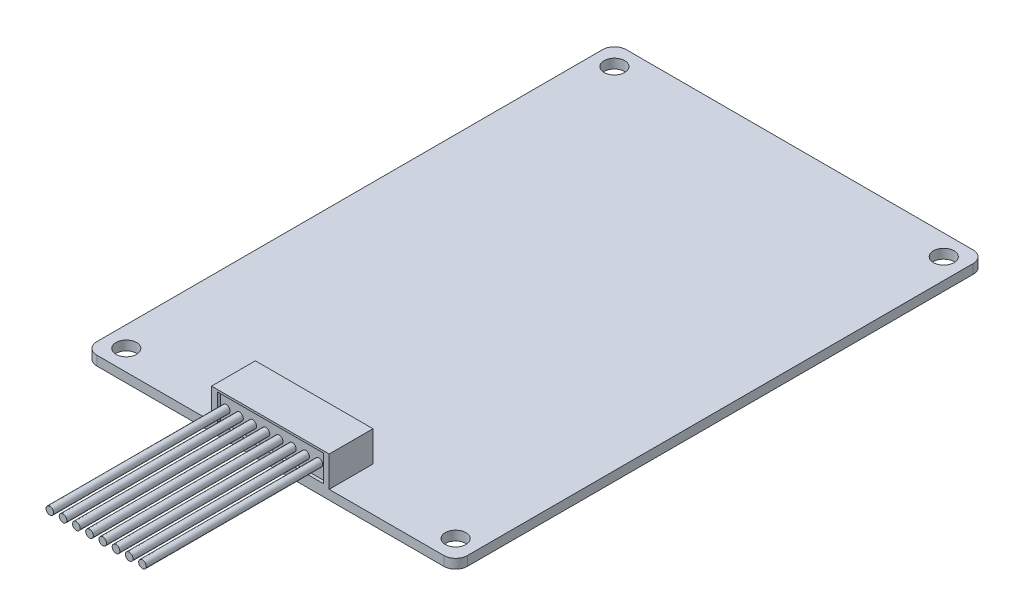
ISO-10303-21;
HEADER;
FILE_DESCRIPTION(('STEP AP214'),'2;1');
FILE_NAME('part.step','',(''),(''),'','','');
FILE_SCHEMA(('AUTOMOTIVE_DESIGN { 1 0 10303 214 1 1 1 1 }'));
ENDSEC;
DATA;
#1=APPLICATION_CONTEXT('core data for automotive mechanical design processes');
#2=APPLICATION_PROTOCOL_DEFINITION('international standard','automotive_design',2000,#1);
#3=PRODUCT_CONTEXT('',#1,'mechanical');
#4=PRODUCT('Part','Part','',(#3));
#5=PRODUCT_RELATED_PRODUCT_CATEGORY('part','',(#4));
#6=PRODUCT_DEFINITION_FORMATION('','',#4);
#7=PRODUCT_DEFINITION_CONTEXT('part definition',#1,'design');
#8=PRODUCT_DEFINITION('design','',#6,#7);
#9=PRODUCT_DEFINITION_SHAPE('','',#8);
#10=(LENGTH_UNIT() NAMED_UNIT(*) SI_UNIT(.MILLI.,.METRE.));
#11=(NAMED_UNIT(*) PLANE_ANGLE_UNIT() SI_UNIT($,.RADIAN.));
#12=(NAMED_UNIT(*) SI_UNIT($,.STERADIAN.) SOLID_ANGLE_UNIT());
#13=UNCERTAINTY_MEASURE_WITH_UNIT(LENGTH_MEASURE(1.E-05),#10,'distance_accuracy_value','');
#14=(GEOMETRIC_REPRESENTATION_CONTEXT(3) GLOBAL_UNCERTAINTY_ASSIGNED_CONTEXT((#13)) GLOBAL_UNIT_ASSIGNED_CONTEXT((#10,
#11,#12)) REPRESENTATION_CONTEXT('',''));
#15=CARTESIAN_POINT('',(0.,0.,0.));
#16=DIRECTION('',(0.,0.,1.));
#17=DIRECTION('',(1.,0.,0.));
#18=AXIS2_PLACEMENT_3D('',#15,#16,#17);
#19=CARTESIAN_POINT('',(29.5,0.8,-43.));
#20=DIRECTION('',(0.,-1.,0.));
#21=DIRECTION('',(0.,0.,-1.));
#22=AXIS2_PLACEMENT_3D('',#19,#20,#21);
#23=PLANE('',#22);
#24=CARTESIAN_POINT('',(-28.,0.8,41.5));
#25=DIRECTION('',(0.,1.,0.));
#26=DIRECTION('',(0.,0.,-1.));
#27=AXIS2_PLACEMENT_3D('',#24,#25,#26);
#28=CIRCLE('',#27,1.75);
#29=CARTESIAN_POINT('',(-28.,0.8,39.75));
#30=VERTEX_POINT('',#29);
#31=EDGE_CURVE('E218',#30,#30,#28,.T.);
#32=ORIENTED_EDGE('',*,*,#31,.F.);
#33=EDGE_LOOP('',(#32));
#34=FACE_BOUND('',#33,.T.);
#35=CARTESIAN_POINT('',(28.,0.8,41.5));
#36=DIRECTION('',(0.,1.,0.));
#37=DIRECTION('',(0.,0.,1.));
#38=AXIS2_PLACEMENT_3D('',#35,#36,#37);
#39=CIRCLE('',#38,1.75);
#40=CARTESIAN_POINT('',(28.,0.8,43.25));
#41=VERTEX_POINT('',#40);
#42=EDGE_CURVE('E224',#41,#41,#39,.T.);
#43=ORIENTED_EDGE('',*,*,#42,.F.);
#44=EDGE_LOOP('',(#43));
#45=FACE_BOUND('',#44,.T.);
#46=CARTESIAN_POINT('',(28.,0.8,-41.5));
#47=DIRECTION('',(0.,1.,0.));
#48=DIRECTION('',(0.,0.,-1.));
#49=AXIS2_PLACEMENT_3D('',#46,#47,#48);
#50=CIRCLE('',#49,1.75);
#51=CARTESIAN_POINT('',(28.,0.8,-43.25));
#52=VERTEX_POINT('',#51);
#53=EDGE_CURVE('E230',#52,#52,#50,.T.);
#54=ORIENTED_EDGE('',*,*,#53,.F.);
#55=EDGE_LOOP('',(#54));
#56=FACE_BOUND('',#55,.T.);
#57=CARTESIAN_POINT('',(-28.,0.8,-41.5));
#58=DIRECTION('',(0.,1.,0.));
#59=DIRECTION('',(0.,0.,1.));
#60=AXIS2_PLACEMENT_3D('',#57,#58,#59);
#61=CIRCLE('',#60,1.75);
#62=CARTESIAN_POINT('',(-28.,0.8,-39.75));
#63=VERTEX_POINT('',#62);
#64=EDGE_CURVE('E236',#63,#63,#61,.T.);
#65=ORIENTED_EDGE('',*,*,#64,.F.);
#66=EDGE_LOOP('',(#65));
#67=FACE_BOUND('',#66,.T.);
#68=DIRECTION('',(0.,0.,-1.));
#69=VECTOR('',#68,1.);
#70=CARTESIAN_POINT('',(10.,0.8,37.55));
#71=LINE('',#70,#69);
#72=CARTESIAN_POINT('',(10.,0.8,45.));
#73=VERTEX_POINT('',#72);
#74=CARTESIAN_POINT('',(10.,0.8,37.55));
#75=VERTEX_POINT('',#74);
#76=EDGE_CURVE('E187',#73,#75,#71,.T.);
#77=ORIENTED_EDGE('',*,*,#76,.F.);
#78=DIRECTION('',(1.,0.,0.));
#79=VECTOR('',#78,1.);
#80=CARTESIAN_POINT('',(29.5,0.8,45.));
#81=LINE('',#80,#79);
#82=CARTESIAN_POINT('',(29.5,0.8,45.));
#83=VERTEX_POINT('',#82);
#84=EDGE_CURVE('E254',#73,#83,#81,.T.);
#85=ORIENTED_EDGE('',*,*,#84,.T.);
#86=CARTESIAN_POINT('',(29.5,0.8,43.));
#87=DIRECTION('',(0.,1.,0.));
#88=DIRECTION('',(0.,0.,-1.));
#89=AXIS2_PLACEMENT_3D('',#86,#87,#88);
#90=CIRCLE('',#89,2.);
#91=CARTESIAN_POINT('',(31.5,0.8,43.));
#92=VERTEX_POINT('',#91);
#93=EDGE_CURVE('E257',#83,#92,#90,.T.);
#94=ORIENTED_EDGE('',*,*,#93,.T.);
#95=DIRECTION('',(0.,0.,-1.));
#96=VECTOR('',#95,1.);
#97=CARTESIAN_POINT('',(31.5,0.8,43.));
#98=LINE('',#97,#96);
#99=CARTESIAN_POINT('',(31.5,0.8,-43.));
#100=VERTEX_POINT('',#99);
#101=EDGE_CURVE('E259',#92,#100,#98,.T.);
#102=ORIENTED_EDGE('',*,*,#101,.T.);
#103=CARTESIAN_POINT('',(29.5,0.8,-43.));
#104=DIRECTION('',(0.,1.,0.));
#105=DIRECTION('',(0.,0.,-1.));
#106=AXIS2_PLACEMENT_3D('',#103,#104,#105);
#107=CIRCLE('',#106,2.);
#108=CARTESIAN_POINT('',(29.5,0.8,-45.));
#109=VERTEX_POINT('',#108);
#110=EDGE_CURVE('E242',#100,#109,#107,.T.);
#111=ORIENTED_EDGE('',*,*,#110,.T.);
#112=DIRECTION('',(-1.,0.,0.));
#113=VECTOR('',#112,1.);
#114=CARTESIAN_POINT('',(29.5,0.8,-45.));
#115=LINE('',#114,#113);
#116=CARTESIAN_POINT('',(-29.5,0.8,-45.));
#117=VERTEX_POINT('',#116);
#118=EDGE_CURVE('E245',#109,#117,#115,.T.);
#119=ORIENTED_EDGE('',*,*,#118,.T.);
#120=CARTESIAN_POINT('',(-29.5,0.8,-43.));
#121=DIRECTION('',(0.,1.,0.));
#122=DIRECTION('',(0.,0.,-1.));
#123=AXIS2_PLACEMENT_3D('',#120,#121,#122);
#124=CIRCLE('',#123,2.);
#125=CARTESIAN_POINT('',(-31.5,0.8,-43.));
#126=VERTEX_POINT('',#125);
#127=EDGE_CURVE('E248',#117,#126,#124,.T.);
#128=ORIENTED_EDGE('',*,*,#127,.T.);
#129=DIRECTION('',(0.,0.,1.));
#130=VECTOR('',#129,1.);
#131=CARTESIAN_POINT('',(-31.5,0.8,43.));
#132=LINE('',#131,#130);
#133=CARTESIAN_POINT('',(-31.5,0.8,43.));
#134=VERTEX_POINT('',#133);
#135=EDGE_CURVE('E250',#126,#134,#132,.T.);
#136=ORIENTED_EDGE('',*,*,#135,.T.);
#137=CARTESIAN_POINT('',(-29.5,0.8,43.));
#138=DIRECTION('',(0.,1.,0.));
#139=DIRECTION('',(0.,0.,1.));
#140=AXIS2_PLACEMENT_3D('',#137,#138,#139);
#141=CIRCLE('',#140,2.);
#142=CARTESIAN_POINT('',(-29.5,0.8,45.));
#143=VERTEX_POINT('',#142);
#144=EDGE_CURVE('E252',#134,#143,#141,.T.);
#145=ORIENTED_EDGE('',*,*,#144,.T.);
#146=CARTESIAN_POINT('',(-9.99999999999999,0.8,45.));
#147=VERTEX_POINT('',#146);
#148=EDGE_CURVE('E255',#143,#147,#81,.T.);
#149=ORIENTED_EDGE('',*,*,#148,.T.);
#150=DIRECTION('',(0.,0.,1.));
#151=VECTOR('',#150,1.);
#152=CARTESIAN_POINT('',(-10.,0.8,37.55));
#153=LINE('',#152,#151);
#154=CARTESIAN_POINT('',(-10.,0.8,37.55));
#155=VERTEX_POINT('',#154);
#156=EDGE_CURVE('E195',#155,#147,#153,.T.);
#157=ORIENTED_EDGE('',*,*,#156,.F.);
#158=DIRECTION('',(-1.,0.,0.));
#159=VECTOR('',#158,1.);
#160=CARTESIAN_POINT('',(-10.,0.8,37.55));
#161=LINE('',#160,#159);
#162=EDGE_CURVE('E58',#75,#155,#161,.T.);
#163=ORIENTED_EDGE('',*,*,#162,.F.);
#164=EDGE_LOOP('',(#77,#85,#94,#102,#111,#119,#128,#136,#145,#149,#157,#163));
#165=FACE_BOUND('',#164,.T.);
#166=ADVANCED_FACE('F35',(#34,#45,#56,#67,#165),#23,.F.);
#167=CARTESIAN_POINT('',(29.5,-0.8,-43.));
#168=DIRECTION('',(0.,-1.,0.));
#169=DIRECTION('',(0.,0.,-1.));
#170=AXIS2_PLACEMENT_3D('',#167,#168,#169);
#171=PLANE('',#170);
#172=CARTESIAN_POINT('',(28.,-0.8,41.5));
#173=DIRECTION('',(0.,1.,0.));
#174=DIRECTION('',(0.,0.,1.));
#175=AXIS2_PLACEMENT_3D('',#172,#173,#174);
#176=CIRCLE('',#175,1.75);
#177=CARTESIAN_POINT('',(28.,-0.8,43.25));
#178=VERTEX_POINT('',#177);
#179=EDGE_CURVE('E221',#178,#178,#176,.T.);
#180=ORIENTED_EDGE('',*,*,#179,.T.);
#181=EDGE_LOOP('',(#180));
#182=FACE_BOUND('',#181,.T.);
#183=CARTESIAN_POINT('',(-28.,-0.8,-41.5));
#184=DIRECTION('',(0.,1.,0.));
#185=DIRECTION('',(0.,0.,1.));
#186=AXIS2_PLACEMENT_3D('',#183,#184,#185);
#187=CIRCLE('',#186,1.75);
#188=CARTESIAN_POINT('',(-28.,-0.8,-39.75));
#189=VERTEX_POINT('',#188);
#190=EDGE_CURVE('E233',#189,#189,#187,.T.);
#191=ORIENTED_EDGE('',*,*,#190,.T.);
#192=EDGE_LOOP('',(#191));
#193=FACE_BOUND('',#192,.T.);
#194=CARTESIAN_POINT('',(29.5,-0.8,-43.));
#195=DIRECTION('',(0.,1.,0.));
#196=DIRECTION('',(0.,0.,-1.));
#197=AXIS2_PLACEMENT_3D('',#194,#195,#196);
#198=CIRCLE('',#197,2.);
#199=CARTESIAN_POINT('',(31.5,-0.8,-43.));
#200=VERTEX_POINT('',#199);
#201=CARTESIAN_POINT('',(29.5,-0.8,-45.));
#202=VERTEX_POINT('',#201);
#203=EDGE_CURVE('E239',#200,#202,#198,.T.);
#204=ORIENTED_EDGE('',*,*,#203,.F.);
#205=DIRECTION('',(0.,0.,-1.));
#206=VECTOR('',#205,1.);
#207=CARTESIAN_POINT('',(31.5,-0.8,43.));
#208=LINE('',#207,#206);
#209=CARTESIAN_POINT('',(31.5,-0.8,43.));
#210=VERTEX_POINT('',#209);
#211=EDGE_CURVE('E246',#210,#200,#208,.T.);
#212=ORIENTED_EDGE('',*,*,#211,.F.);
#213=CARTESIAN_POINT('',(29.5,-0.8,43.));
#214=DIRECTION('',(0.,1.,0.));
#215=DIRECTION('',(0.,0.,-1.));
#216=AXIS2_PLACEMENT_3D('',#213,#214,#215);
#217=CIRCLE('',#216,2.);
#218=CARTESIAN_POINT('',(29.5,-0.8,45.));
#219=VERTEX_POINT('',#218);
#220=EDGE_CURVE('E274',#219,#210,#217,.T.);
#221=ORIENTED_EDGE('',*,*,#220,.F.);
#222=DIRECTION('',(1.,0.,0.));
#223=VECTOR('',#222,1.);
#224=CARTESIAN_POINT('',(29.5,-0.8,45.));
#225=LINE('',#224,#223);
#226=CARTESIAN_POINT('',(-29.5,-0.8,45.));
#227=VERTEX_POINT('',#226);
#228=EDGE_CURVE('E272',#227,#219,#225,.T.);
#229=ORIENTED_EDGE('',*,*,#228,.F.);
#230=CARTESIAN_POINT('',(-29.5,-0.8,43.));
#231=DIRECTION('',(0.,1.,0.));
#232=DIRECTION('',(0.,0.,1.));
#233=AXIS2_PLACEMENT_3D('',#230,#231,#232);
#234=CIRCLE('',#233,2.);
#235=CARTESIAN_POINT('',(-31.5,-0.8,43.));
#236=VERTEX_POINT('',#235);
#237=EDGE_CURVE('E270',#236,#227,#234,.T.);
#238=ORIENTED_EDGE('',*,*,#237,.F.);
#239=DIRECTION('',(0.,0.,1.));
#240=VECTOR('',#239,1.);
#241=CARTESIAN_POINT('',(-31.5,-0.8,43.));
#242=LINE('',#241,#240);
#243=CARTESIAN_POINT('',(-31.5,-0.8,-43.));
#244=VERTEX_POINT('',#243);
#245=EDGE_CURVE('E268',#244,#236,#242,.T.);
#246=ORIENTED_EDGE('',*,*,#245,.F.);
#247=CARTESIAN_POINT('',(-29.5,-0.8,-43.));
#248=DIRECTION('',(0.,1.,0.));
#249=DIRECTION('',(0.,0.,-1.));
#250=AXIS2_PLACEMENT_3D('',#247,#248,#249);
#251=CIRCLE('',#250,2.);
#252=CARTESIAN_POINT('',(-29.5,-0.8,-45.));
#253=VERTEX_POINT('',#252);
#254=EDGE_CURVE('E266',#253,#244,#251,.T.);
#255=ORIENTED_EDGE('',*,*,#254,.F.);
#256=DIRECTION('',(-1.,0.,0.));
#257=VECTOR('',#256,1.);
#258=CARTESIAN_POINT('',(29.5,-0.8,-45.));
#259=LINE('',#258,#257);
#260=EDGE_CURVE('E264',#202,#253,#259,.T.);
#261=ORIENTED_EDGE('',*,*,#260,.F.);
#262=EDGE_LOOP('',(#204,#212,#221,#229,#238,#246,#255,#261));
#263=FACE_BOUND('',#262,.T.);
#264=CARTESIAN_POINT('',(28.,-0.8,-41.5));
#265=DIRECTION('',(0.,1.,0.));
#266=DIRECTION('',(0.,0.,-1.));
#267=AXIS2_PLACEMENT_3D('',#264,#265,#266);
#268=CIRCLE('',#267,1.75);
#269=CARTESIAN_POINT('',(28.,-0.8,-43.25));
#270=VERTEX_POINT('',#269);
#271=EDGE_CURVE('E227',#270,#270,#268,.T.);
#272=ORIENTED_EDGE('',*,*,#271,.T.);
#273=EDGE_LOOP('',(#272));
#274=FACE_BOUND('',#273,.T.);
#275=CARTESIAN_POINT('',(-28.,-0.8,41.5));
#276=DIRECTION('',(0.,1.,0.));
#277=DIRECTION('',(0.,0.,-1.));
#278=AXIS2_PLACEMENT_3D('',#275,#276,#277);
#279=CIRCLE('',#278,1.75);
#280=CARTESIAN_POINT('',(-28.,-0.8,39.75));
#281=VERTEX_POINT('',#280);
#282=EDGE_CURVE('E217',#281,#281,#279,.T.);
#283=ORIENTED_EDGE('',*,*,#282,.T.);
#284=EDGE_LOOP('',(#283));
#285=FACE_BOUND('',#284,.T.);
#286=ADVANCED_FACE('F304',(#182,#193,#263,#274,#285),#171,.T.);
#287=CARTESIAN_POINT('',(29.5,0.8,-43.));
#288=DIRECTION('',(0.,-1.,0.));
#289=DIRECTION('',(0.,0.,-1.));
#290=AXIS2_PLACEMENT_3D('',#287,#288,#289);
#291=CYLINDRICAL_SURFACE('',#290,2.);
#292=ORIENTED_EDGE('',*,*,#203,.T.);
#293=DIRECTION('',(0.,-1.,0.));
#294=VECTOR('',#293,1.);
#295=CARTESIAN_POINT('',(29.5,0.8,-45.));
#296=LINE('',#295,#294);
#297=EDGE_CURVE('E11',#109,#202,#296,.T.);
#298=ORIENTED_EDGE('',*,*,#297,.F.);
#299=ORIENTED_EDGE('',*,*,#110,.F.);
#300=DIRECTION('',(0.,-1.,0.));
#301=VECTOR('',#300,1.);
#302=CARTESIAN_POINT('',(31.5,0.8,-43.));
#303=LINE('',#302,#301);
#304=EDGE_CURVE('E261',#100,#200,#303,.T.);
#305=ORIENTED_EDGE('',*,*,#304,.T.);
#306=EDGE_LOOP('',(#292,#298,#299,#305));
#307=FACE_BOUND('',#306,.T.);
#308=ADVANCED_FACE('F37',(#307),#291,.T.);
#309=CARTESIAN_POINT('',(29.5,0.8,-45.));
#310=DIRECTION('',(0.,0.,1.));
#311=DIRECTION('',(1.,0.,0.));
#312=AXIS2_PLACEMENT_3D('',#309,#310,#311);
#313=PLANE('',#312);
#314=ORIENTED_EDGE('',*,*,#260,.T.);
#315=DIRECTION('',(0.,-1.,0.));
#316=VECTOR('',#315,1.);
#317=CARTESIAN_POINT('',(-29.5,0.8,-45.));
#318=LINE('',#317,#316);
#319=EDGE_CURVE('E43',#117,#253,#318,.T.);
#320=ORIENTED_EDGE('',*,*,#319,.F.);
#321=ORIENTED_EDGE('',*,*,#118,.F.);
#322=ORIENTED_EDGE('',*,*,#297,.T.);
#323=EDGE_LOOP('',(#314,#320,#321,#322));
#324=FACE_BOUND('',#323,.T.);
#325=ADVANCED_FACE('F319',(#324),#313,.F.);
#326=CARTESIAN_POINT('',(-29.5,0.8,-43.));
#327=DIRECTION('',(0.,-1.,0.));
#328=DIRECTION('',(0.,0.,-1.));
#329=AXIS2_PLACEMENT_3D('',#326,#327,#328);
#330=CYLINDRICAL_SURFACE('',#329,2.);
#331=ORIENTED_EDGE('',*,*,#254,.T.);
#332=DIRECTION('',(0.,-1.,0.));
#333=VECTOR('',#332,1.);
#334=CARTESIAN_POINT('',(-31.5,0.8,-43.));
#335=LINE('',#334,#333);
#336=EDGE_CURVE('E291',#126,#244,#335,.T.);
#337=ORIENTED_EDGE('',*,*,#336,.F.);
#338=ORIENTED_EDGE('',*,*,#127,.F.);
#339=ORIENTED_EDGE('',*,*,#319,.T.);
#340=EDGE_LOOP('',(#331,#337,#338,#339));
#341=FACE_BOUND('',#340,.T.);
#342=ADVANCED_FACE('F298',(#341),#330,.T.);
#343=CARTESIAN_POINT('',(-31.5,0.8,43.));
#344=DIRECTION('',(1.,0.,0.));
#345=DIRECTION('',(0.,0.,-1.));
#346=AXIS2_PLACEMENT_3D('',#343,#344,#345);
#347=PLANE('',#346);
#348=ORIENTED_EDGE('',*,*,#245,.T.);
#349=DIRECTION('',(0.,-1.,0.));
#350=VECTOR('',#349,1.);
#351=CARTESIAN_POINT('',(-31.5,0.8,43.));
#352=LINE('',#351,#350);
#353=EDGE_CURVE('E288',#134,#236,#352,.T.);
#354=ORIENTED_EDGE('',*,*,#353,.F.);
#355=ORIENTED_EDGE('',*,*,#135,.F.);
#356=ORIENTED_EDGE('',*,*,#336,.T.);
#357=EDGE_LOOP('',(#348,#354,#355,#356));
#358=FACE_BOUND('',#357,.T.);
#359=ADVANCED_FACE('F310',(#358),#347,.F.);
#360=CARTESIAN_POINT('',(-29.5,0.8,43.));
#361=DIRECTION('',(0.,-1.,0.));
#362=DIRECTION('',(0.,0.,-1.));
#363=AXIS2_PLACEMENT_3D('',#360,#361,#362);
#364=CYLINDRICAL_SURFACE('',#363,2.);
#365=ORIENTED_EDGE('',*,*,#237,.T.);
#366=DIRECTION('',(0.,-1.,0.));
#367=VECTOR('',#366,1.);
#368=CARTESIAN_POINT('',(-29.5,0.8,45.));
#369=LINE('',#368,#367);
#370=EDGE_CURVE('E285',#143,#227,#369,.T.);
#371=ORIENTED_EDGE('',*,*,#370,.F.);
#372=ORIENTED_EDGE('',*,*,#144,.F.);
#373=ORIENTED_EDGE('',*,*,#353,.T.);
#374=EDGE_LOOP('',(#365,#371,#372,#373));
#375=FACE_BOUND('',#374,.T.);
#376=ADVANCED_FACE('F314',(#375),#364,.T.);
#377=CARTESIAN_POINT('',(29.5,0.8,45.));
#378=DIRECTION('',(0.,0.,-1.));
#379=DIRECTION('',(-1.,0.,0.));
#380=AXIS2_PLACEMENT_3D('',#377,#378,#379);
#381=PLANE('',#380);
#382=DIRECTION('',(1.,0.,0.));
#383=VECTOR('',#382,1.);
#384=CARTESIAN_POINT('',(9.00000000000001,1.15,45.));
#385=LINE('',#384,#383);
#386=CARTESIAN_POINT('',(-8.99999999999999,1.15,45.));
#387=VERTEX_POINT('',#386);
#388=CARTESIAN_POINT('',(9.00000000000001,1.15,45.));
#389=VERTEX_POINT('',#388);
#390=EDGE_CURVE('E180',#387,#389,#385,.T.);
#391=ORIENTED_EDGE('',*,*,#390,.F.);
#392=DIRECTION('',(0.,-1.,0.));
#393=VECTOR('',#392,1.);
#394=CARTESIAN_POINT('',(-8.99999999999999,1.15,45.));
#395=LINE('',#394,#393);
#396=CARTESIAN_POINT('',(-8.99999999999999,5.65,45.));
#397=VERTEX_POINT('',#396);
#398=EDGE_CURVE('E50',#397,#387,#395,.T.);
#399=ORIENTED_EDGE('',*,*,#398,.F.);
#400=DIRECTION('',(-1.,0.,0.));
#401=VECTOR('',#400,1.);
#402=CARTESIAN_POINT('',(9.00000000000001,5.65,45.));
#403=LINE('',#402,#401);
#404=CARTESIAN_POINT('',(9.00000000000001,5.65,45.));
#405=VERTEX_POINT('',#404);
#406=EDGE_CURVE('E168',#405,#397,#403,.T.);
#407=ORIENTED_EDGE('',*,*,#406,.F.);
#408=DIRECTION('',(0.,1.,0.));
#409=VECTOR('',#408,1.);
#410=CARTESIAN_POINT('',(9.00000000000001,1.15,45.));
#411=LINE('',#410,#409);
#412=EDGE_CURVE('E171',#389,#405,#411,.T.);
#413=ORIENTED_EDGE('',*,*,#412,.F.);
#414=EDGE_LOOP('',(#391,#399,#407,#413));
#415=FACE_BOUND('',#414,.T.);
#416=ORIENTED_EDGE('',*,*,#228,.T.);
#417=DIRECTION('',(0.,-1.,0.));
#418=VECTOR('',#417,1.);
#419=CARTESIAN_POINT('',(29.5,0.8,45.));
#420=LINE('',#419,#418);
#421=EDGE_CURVE('E282',#83,#219,#420,.T.);
#422=ORIENTED_EDGE('',*,*,#421,.F.);
#423=ORIENTED_EDGE('',*,*,#84,.F.);
#424=DIRECTION('',(0.,-1.,0.));
#425=VECTOR('',#424,1.);
#426=CARTESIAN_POINT('',(10.,6.,45.));
#427=LINE('',#426,#425);
#428=CARTESIAN_POINT('',(10.,6.,45.));
#429=VERTEX_POINT('',#428);
#430=EDGE_CURVE('E201',#429,#73,#427,.T.);
#431=ORIENTED_EDGE('',*,*,#430,.F.);
#432=DIRECTION('',(1.,0.,0.));
#433=VECTOR('',#432,1.);
#434=CARTESIAN_POINT('',(-10.,6.,45.));
#435=LINE('',#434,#433);
#436=CARTESIAN_POINT('',(-10.,6.,45.));
#437=VERTEX_POINT('',#436);
#438=EDGE_CURVE('E199',#437,#429,#435,.T.);
#439=ORIENTED_EDGE('',*,*,#438,.F.);
#440=DIRECTION('',(0.,-1.,0.));
#441=VECTOR('',#440,1.);
#442=CARTESIAN_POINT('',(-10.,6.,45.));
#443=LINE('',#442,#441);
#444=EDGE_CURVE('E209',#437,#147,#443,.T.);
#445=ORIENTED_EDGE('',*,*,#444,.T.);
#446=ORIENTED_EDGE('',*,*,#148,.F.);
#447=ORIENTED_EDGE('',*,*,#370,.T.);
#448=EDGE_LOOP('',(#416,#422,#423,#431,#439,#445,#446,#447));
#449=FACE_BOUND('',#448,.T.);
#450=ADVANCED_FACE('F334',(#415,#449),#381,.F.);
#451=CARTESIAN_POINT('',(29.5,0.8,43.));
#452=DIRECTION('',(0.,-1.,0.));
#453=DIRECTION('',(0.,0.,-1.));
#454=AXIS2_PLACEMENT_3D('',#451,#452,#453);
#455=CYLINDRICAL_SURFACE('',#454,2.);
#456=ORIENTED_EDGE('',*,*,#220,.T.);
#457=DIRECTION('',(0.,-1.,0.));
#458=VECTOR('',#457,1.);
#459=CARTESIAN_POINT('',(31.5,0.8,43.));
#460=LINE('',#459,#458);
#461=EDGE_CURVE('E279',#92,#210,#460,.T.);
#462=ORIENTED_EDGE('',*,*,#461,.F.);
#463=ORIENTED_EDGE('',*,*,#93,.F.);
#464=ORIENTED_EDGE('',*,*,#421,.T.);
#465=EDGE_LOOP('',(#456,#462,#463,#464));
#466=FACE_BOUND('',#465,.T.);
#467=ADVANCED_FACE('F330',(#466),#455,.T.);
#468=CARTESIAN_POINT('',(31.5,0.8,43.));
#469=DIRECTION('',(-1.,0.,0.));
#470=DIRECTION('',(0.,0.,1.));
#471=AXIS2_PLACEMENT_3D('',#468,#469,#470);
#472=PLANE('',#471);
#473=ORIENTED_EDGE('',*,*,#211,.T.);
#474=ORIENTED_EDGE('',*,*,#304,.F.);
#475=ORIENTED_EDGE('',*,*,#101,.F.);
#476=ORIENTED_EDGE('',*,*,#461,.T.);
#477=EDGE_LOOP('',(#473,#474,#475,#476));
#478=FACE_BOUND('',#477,.T.);
#479=ADVANCED_FACE('F325',(#478),#472,.F.);
#480=CARTESIAN_POINT('',(-28.,0.8,-41.5));
#481=DIRECTION('',(0.,-1.,0.));
#482=DIRECTION('',(0.,0.,-1.));
#483=AXIS2_PLACEMENT_3D('',#480,#481,#482);
#484=CYLINDRICAL_SURFACE('',#483,1.75);
#485=ORIENTED_EDGE('',*,*,#64,.T.);
#486=EDGE_LOOP('',(#485));
#487=FACE_BOUND('',#486,.T.);
#488=ORIENTED_EDGE('',*,*,#190,.F.);
#489=EDGE_LOOP('',(#488));
#490=FACE_BOUND('',#489,.T.);
#491=ADVANCED_FACE('F372',(#487,#490),#484,.F.);
#492=CARTESIAN_POINT('',(28.,0.8,-41.5));
#493=DIRECTION('',(0.,-1.,0.));
#494=DIRECTION('',(0.,0.,-1.));
#495=AXIS2_PLACEMENT_3D('',#492,#493,#494);
#496=CYLINDRICAL_SURFACE('',#495,1.75);
#497=ORIENTED_EDGE('',*,*,#53,.T.);
#498=EDGE_LOOP('',(#497));
#499=FACE_BOUND('',#498,.T.);
#500=ORIENTED_EDGE('',*,*,#271,.F.);
#501=EDGE_LOOP('',(#500));
#502=FACE_BOUND('',#501,.T.);
#503=ADVANCED_FACE('F446',(#499,#502),#496,.F.);
#504=CARTESIAN_POINT('',(28.,0.8,41.5));
#505=DIRECTION('',(0.,-1.,0.));
#506=DIRECTION('',(0.,0.,-1.));
#507=AXIS2_PLACEMENT_3D('',#504,#505,#506);
#508=CYLINDRICAL_SURFACE('',#507,1.75);
#509=ORIENTED_EDGE('',*,*,#42,.T.);
#510=EDGE_LOOP('',(#509));
#511=FACE_BOUND('',#510,.T.);
#512=ORIENTED_EDGE('',*,*,#179,.F.);
#513=EDGE_LOOP('',(#512));
#514=FACE_BOUND('',#513,.T.);
#515=ADVANCED_FACE('F454',(#511,#514),#508,.F.);
#516=CARTESIAN_POINT('',(-28.,0.8,41.5));
#517=DIRECTION('',(0.,-1.,0.));
#518=DIRECTION('',(0.,0.,-1.));
#519=AXIS2_PLACEMENT_3D('',#516,#517,#518);
#520=CYLINDRICAL_SURFACE('',#519,1.75);
#521=ORIENTED_EDGE('',*,*,#31,.T.);
#522=EDGE_LOOP('',(#521));
#523=FACE_BOUND('',#522,.T.);
#524=ORIENTED_EDGE('',*,*,#282,.F.);
#525=EDGE_LOOP('',(#524));
#526=FACE_BOUND('',#525,.T.);
#527=ADVANCED_FACE('F462',(#523,#526),#520,.F.);
#528=CARTESIAN_POINT('',(10.,6.,37.55));
#529=DIRECTION('',(-1.,0.,0.));
#530=DIRECTION('',(0.,0.,1.));
#531=AXIS2_PLACEMENT_3D('',#528,#529,#530);
#532=PLANE('',#531);
#533=ORIENTED_EDGE('',*,*,#76,.T.);
#534=DIRECTION('',(0.,-1.,0.));
#535=VECTOR('',#534,1.);
#536=CARTESIAN_POINT('',(10.,6.,37.55));
#537=LINE('',#536,#535);
#538=CARTESIAN_POINT('',(10.,6.,37.55));
#539=VERTEX_POINT('',#538);
#540=EDGE_CURVE('E215',#539,#75,#537,.T.);
#541=ORIENTED_EDGE('',*,*,#540,.F.);
#542=DIRECTION('',(0.,0.,-1.));
#543=VECTOR('',#542,1.);
#544=CARTESIAN_POINT('',(10.,6.,37.55));
#545=LINE('',#544,#543);
#546=EDGE_CURVE('E191',#429,#539,#545,.T.);
#547=ORIENTED_EDGE('',*,*,#546,.F.);
#548=ORIENTED_EDGE('',*,*,#430,.T.);
#549=EDGE_LOOP('',(#533,#541,#547,#548));
#550=FACE_BOUND('',#549,.T.);
#551=ADVANCED_FACE('F347',(#550),#532,.F.);
#552=CARTESIAN_POINT('',(-10.,6.,37.55));
#553=DIRECTION('',(0.,0.,1.));
#554=DIRECTION('',(1.,0.,0.));
#555=AXIS2_PLACEMENT_3D('',#552,#553,#554);
#556=PLANE('',#555);
#557=ORIENTED_EDGE('',*,*,#162,.T.);
#558=DIRECTION('',(0.,-1.,0.));
#559=VECTOR('',#558,1.);
#560=CARTESIAN_POINT('',(-10.,6.,37.55));
#561=LINE('',#560,#559);
#562=CARTESIAN_POINT('',(-10.,6.,37.55));
#563=VERTEX_POINT('',#562);
#564=EDGE_CURVE('E212',#563,#155,#561,.T.);
#565=ORIENTED_EDGE('',*,*,#564,.F.);
#566=DIRECTION('',(-1.,0.,0.));
#567=VECTOR('',#566,1.);
#568=CARTESIAN_POINT('',(-10.,6.,37.55));
#569=LINE('',#568,#567);
#570=EDGE_CURVE('E194',#539,#563,#569,.T.);
#571=ORIENTED_EDGE('',*,*,#570,.F.);
#572=ORIENTED_EDGE('',*,*,#540,.T.);
#573=EDGE_LOOP('',(#557,#565,#571,#572));
#574=FACE_BOUND('',#573,.T.);
#575=ADVANCED_FACE('F343',(#574),#556,.F.);
#576=CARTESIAN_POINT('',(-10.,6.,37.55));
#577=DIRECTION('',(1.,0.,0.));
#578=DIRECTION('',(0.,0.,-1.));
#579=AXIS2_PLACEMENT_3D('',#576,#577,#578);
#580=PLANE('',#579);
#581=ORIENTED_EDGE('',*,*,#156,.T.);
#582=ORIENTED_EDGE('',*,*,#444,.F.);
#583=DIRECTION('',(0.,0.,1.));
#584=VECTOR('',#583,1.);
#585=CARTESIAN_POINT('',(-10.,6.,37.55));
#586=LINE('',#585,#584);
#587=EDGE_CURVE('E197',#563,#437,#586,.T.);
#588=ORIENTED_EDGE('',*,*,#587,.F.);
#589=ORIENTED_EDGE('',*,*,#564,.T.);
#590=EDGE_LOOP('',(#581,#582,#588,#589));
#591=FACE_BOUND('',#590,.T.);
#592=ADVANCED_FACE('F340',(#591),#580,.F.);
#593=CARTESIAN_POINT('',(0.,6.,0.));
#594=DIRECTION('',(0.,1.,0.));
#595=DIRECTION('',(0.,0.,1.));
#596=AXIS2_PLACEMENT_3D('',#593,#594,#595);
#597=PLANE('',#596);
#598=ORIENTED_EDGE('',*,*,#546,.T.);
#599=ORIENTED_EDGE('',*,*,#570,.T.);
#600=ORIENTED_EDGE('',*,*,#587,.T.);
#601=ORIENTED_EDGE('',*,*,#438,.T.);
#602=EDGE_LOOP('',(#598,#599,#600,#601));
#603=FACE_BOUND('',#602,.T.);
#604=ADVANCED_FACE('F349',(#603),#597,.T.);
#605=CARTESIAN_POINT('',(-8.99999999999999,1.15,44.5));
#606=DIRECTION('',(-1.,0.,0.));
#607=DIRECTION('',(0.,0.,1.));
#608=AXIS2_PLACEMENT_3D('',#605,#606,#607);
#609=PLANE('',#608);
#610=ORIENTED_EDGE('',*,*,#398,.T.);
#611=DIRECTION('',(0.,0.,1.));
#612=VECTOR('',#611,1.);
#613=CARTESIAN_POINT('',(-8.99999999999999,1.15,44.5));
#614=LINE('',#613,#612);
#615=CARTESIAN_POINT('',(-8.99999999999999,1.15,44.5));
#616=VERTEX_POINT('',#615);
#617=EDGE_CURVE('E146',#616,#387,#614,.T.);
#618=ORIENTED_EDGE('',*,*,#617,.F.);
#619=DIRECTION('',(0.,-1.,0.));
#620=VECTOR('',#619,1.);
#621=CARTESIAN_POINT('',(-8.99999999999999,1.15,44.5));
#622=LINE('',#621,#620);
#623=CARTESIAN_POINT('',(-8.99999999999999,5.65,44.5));
#624=VERTEX_POINT('',#623);
#625=EDGE_CURVE('E150',#624,#616,#622,.T.);
#626=ORIENTED_EDGE('',*,*,#625,.F.);
#627=DIRECTION('',(0.,0.,1.));
#628=VECTOR('',#627,1.);
#629=CARTESIAN_POINT('',(-8.99999999999999,5.65,44.5));
#630=LINE('',#629,#628);
#631=EDGE_CURVE('E185',#624,#397,#630,.T.);
#632=ORIENTED_EDGE('',*,*,#631,.T.);
#633=EDGE_LOOP('',(#610,#618,#626,#632));
#634=FACE_BOUND('',#633,.T.);
#635=ADVANCED_FACE('F148',(#634),#609,.F.);
#636=CARTESIAN_POINT('',(9.00000000000001,5.65,44.5));
#637=DIRECTION('',(0.,1.,0.));
#638=DIRECTION('',(-1.,0.,0.));
#639=AXIS2_PLACEMENT_3D('',#636,#637,#638);
#640=PLANE('',#639);
#641=ORIENTED_EDGE('',*,*,#406,.T.);
#642=ORIENTED_EDGE('',*,*,#631,.F.);
#643=DIRECTION('',(-1.,0.,0.));
#644=VECTOR('',#643,1.);
#645=CARTESIAN_POINT('',(9.00000000000001,5.65,44.5));
#646=LINE('',#645,#644);
#647=CARTESIAN_POINT('',(9.00000000000001,5.65,44.5));
#648=VERTEX_POINT('',#647);
#649=EDGE_CURVE('E156',#648,#624,#646,.T.);
#650=ORIENTED_EDGE('',*,*,#649,.F.);
#651=DIRECTION('',(0.,0.,1.));
#652=VECTOR('',#651,1.);
#653=CARTESIAN_POINT('',(9.00000000000001,5.65,44.5));
#654=LINE('',#653,#652);
#655=EDGE_CURVE('E188',#648,#405,#654,.T.);
#656=ORIENTED_EDGE('',*,*,#655,.T.);
#657=EDGE_LOOP('',(#641,#642,#650,#656));
#658=FACE_BOUND('',#657,.T.);
#659=ADVANCED_FACE('F356',(#658),#640,.F.);
#660=CARTESIAN_POINT('',(9.00000000000001,1.15,44.5));
#661=DIRECTION('',(1.,0.,0.));
#662=DIRECTION('',(0.,0.,-1.));
#663=AXIS2_PLACEMENT_3D('',#660,#661,#662);
#664=PLANE('',#663);
#665=ORIENTED_EDGE('',*,*,#412,.T.);
#666=ORIENTED_EDGE('',*,*,#655,.F.);
#667=DIRECTION('',(0.,1.,0.));
#668=VECTOR('',#667,1.);
#669=CARTESIAN_POINT('',(9.00000000000001,1.15,44.5));
#670=LINE('',#669,#668);
#671=CARTESIAN_POINT('',(9.00000000000001,1.15,44.5));
#672=VERTEX_POINT('',#671);
#673=EDGE_CURVE('E164',#672,#648,#670,.T.);
#674=ORIENTED_EDGE('',*,*,#673,.F.);
#675=DIRECTION('',(0.,0.,1.));
#676=VECTOR('',#675,1.);
#677=CARTESIAN_POINT('',(9.00000000000001,1.15,44.5));
#678=LINE('',#677,#676);
#679=EDGE_CURVE('E155',#672,#389,#678,.T.);
#680=ORIENTED_EDGE('',*,*,#679,.T.);
#681=EDGE_LOOP('',(#665,#666,#674,#680));
#682=FACE_BOUND('',#681,.T.);
#683=ADVANCED_FACE('F510',(#682),#664,.F.);
#684=CARTESIAN_POINT('',(9.00000000000001,1.15,44.5));
#685=DIRECTION('',(0.,-1.,0.));
#686=DIRECTION('',(1.,0.,0.));
#687=AXIS2_PLACEMENT_3D('',#684,#685,#686);
#688=PLANE('',#687);
#689=ORIENTED_EDGE('',*,*,#390,.T.);
#690=ORIENTED_EDGE('',*,*,#679,.F.);
#691=DIRECTION('',(1.,0.,0.));
#692=VECTOR('',#691,1.);
#693=CARTESIAN_POINT('',(9.00000000000001,1.15,44.5));
#694=LINE('',#693,#692);
#695=EDGE_CURVE('E159',#616,#672,#694,.T.);
#696=ORIENTED_EDGE('',*,*,#695,.F.);
#697=ORIENTED_EDGE('',*,*,#617,.T.);
#698=EDGE_LOOP('',(#689,#690,#696,#697));
#699=FACE_BOUND('',#698,.T.);
#700=ADVANCED_FACE('F160',(#699),#688,.F.);
#701=CARTESIAN_POINT('',(0.,0.,44.5));
#702=DIRECTION('',(0.,0.,1.));
#703=DIRECTION('',(1.,0.,0.));
#704=AXIS2_PLACEMENT_3D('',#701,#702,#703);
#705=PLANE('',#704);
#706=CARTESIAN_POINT('',(7.75000000000001,3.4,44.5));
#707=DIRECTION('',(0.,0.,1.));
#708=DIRECTION('',(1.,0.,0.));
#709=AXIS2_PLACEMENT_3D('',#706,#707,#708);
#710=CIRCLE('',#709,0.650000000000001);
#711=CARTESIAN_POINT('',(8.40000000000001,3.4,44.5));
#712=VERTEX_POINT('',#711);
#713=EDGE_CURVE('E733',#712,#712,#710,.T.);
#714=ORIENTED_EDGE('',*,*,#713,.F.);
#715=EDGE_LOOP('',(#714));
#716=FACE_BOUND('',#715,.T.);
#717=CARTESIAN_POINT('',(5.50000000000001,3.4,44.5));
#718=DIRECTION('',(0.,0.,1.));
#719=DIRECTION('',(1.,0.,0.));
#720=AXIS2_PLACEMENT_3D('',#717,#718,#719);
#721=CIRCLE('',#720,0.65);
#722=CARTESIAN_POINT('',(6.15000000000001,3.4,44.5));
#723=VERTEX_POINT('',#722);
#724=EDGE_CURVE('E732',#723,#723,#721,.T.);
#725=ORIENTED_EDGE('',*,*,#724,.F.);
#726=EDGE_LOOP('',(#725));
#727=FACE_BOUND('',#726,.T.);
#728=CARTESIAN_POINT('',(3.25000000000001,3.4,44.5));
#729=DIRECTION('',(0.,0.,1.));
#730=DIRECTION('',(1.,0.,0.));
#731=AXIS2_PLACEMENT_3D('',#728,#729,#730);
#732=CIRCLE('',#731,0.65);
#733=CARTESIAN_POINT('',(3.90000000000001,3.4,44.5));
#734=VERTEX_POINT('',#733);
#735=EDGE_CURVE('E742',#734,#734,#732,.T.);
#736=ORIENTED_EDGE('',*,*,#735,.F.);
#737=EDGE_LOOP('',(#736));
#738=FACE_BOUND('',#737,.T.);
#739=CARTESIAN_POINT('',(1.00000000000001,3.4,44.5));
#740=DIRECTION('',(0.,0.,1.));
#741=DIRECTION('',(1.,0.,0.));
#742=AXIS2_PLACEMENT_3D('',#739,#740,#741);
#743=CIRCLE('',#742,0.65);
#744=CARTESIAN_POINT('',(1.65000000000001,3.4,44.5));
#745=VERTEX_POINT('',#744);
#746=EDGE_CURVE('E747',#745,#745,#743,.T.);
#747=ORIENTED_EDGE('',*,*,#746,.F.);
#748=EDGE_LOOP('',(#747));
#749=FACE_BOUND('',#748,.T.);
#750=CARTESIAN_POINT('',(-1.24999999999999,3.4,44.5));
#751=DIRECTION('',(0.,0.,1.));
#752=DIRECTION('',(1.,0.,0.));
#753=AXIS2_PLACEMENT_3D('',#750,#751,#752);
#754=CIRCLE('',#753,0.65);
#755=CARTESIAN_POINT('',(-0.599999999999991,3.4,44.5));
#756=VERTEX_POINT('',#755);
#757=EDGE_CURVE('E753',#756,#756,#754,.T.);
#758=ORIENTED_EDGE('',*,*,#757,.F.);
#759=EDGE_LOOP('',(#758));
#760=FACE_BOUND('',#759,.T.);
#761=CARTESIAN_POINT('',(-3.49999999999999,3.4,44.5));
#762=DIRECTION('',(0.,0.,1.));
#763=DIRECTION('',(1.,0.,0.));
#764=AXIS2_PLACEMENT_3D('',#761,#762,#763);
#765=CIRCLE('',#764,0.65);
#766=CARTESIAN_POINT('',(-2.84999999999999,3.4,44.5));
#767=VERTEX_POINT('',#766);
#768=EDGE_CURVE('E759',#767,#767,#765,.T.);
#769=ORIENTED_EDGE('',*,*,#768,.F.);
#770=EDGE_LOOP('',(#769));
#771=FACE_BOUND('',#770,.T.);
#772=CARTESIAN_POINT('',(-5.74999999999999,3.4,44.5));
#773=DIRECTION('',(0.,0.,1.));
#774=DIRECTION('',(1.,0.,0.));
#775=AXIS2_PLACEMENT_3D('',#772,#773,#774);
#776=CIRCLE('',#775,0.649999999999999);
#777=CARTESIAN_POINT('',(-5.09999999999999,3.4,44.5));
#778=VERTEX_POINT('',#777);
#779=EDGE_CURVE('E765',#778,#778,#776,.T.);
#780=ORIENTED_EDGE('',*,*,#779,.F.);
#781=EDGE_LOOP('',(#780));
#782=FACE_BOUND('',#781,.T.);
#783=CARTESIAN_POINT('',(-7.99999999999999,3.4,44.5));
#784=DIRECTION('',(0.,0.,1.));
#785=DIRECTION('',(1.,0.,0.));
#786=AXIS2_PLACEMENT_3D('',#783,#784,#785);
#787=CIRCLE('',#786,0.65);
#788=CARTESIAN_POINT('',(-7.34999999999999,3.4,44.5));
#789=VERTEX_POINT('',#788);
#790=EDGE_CURVE('E174',#789,#789,#787,.T.);
#791=ORIENTED_EDGE('',*,*,#790,.F.);
#792=EDGE_LOOP('',(#791));
#793=FACE_BOUND('',#792,.T.);
#794=ORIENTED_EDGE('',*,*,#625,.T.);
#795=ORIENTED_EDGE('',*,*,#695,.T.);
#796=ORIENTED_EDGE('',*,*,#673,.T.);
#797=ORIENTED_EDGE('',*,*,#649,.T.);
#798=EDGE_LOOP('',(#794,#795,#796,#797));
#799=FACE_BOUND('',#798,.T.);
#800=ADVANCED_FACE('F166',(#716,#727,#738,#749,#760,#771,#782,#793,#799),#705,.T.);
#801=CARTESIAN_POINT('',(-7.99999999999999,3.4,74.5));
#802=DIRECTION('',(0.,0.,-1.));
#803=DIRECTION('',(-1.,0.,0.));
#804=AXIS2_PLACEMENT_3D('',#801,#802,#803);
#805=CYLINDRICAL_SURFACE('',#804,0.65);
#806=CARTESIAN_POINT('',(-7.99999999999999,3.4,74.5));
#807=DIRECTION('',(0.,0.,1.));
#808=DIRECTION('',(1.,0.,0.));
#809=AXIS2_PLACEMENT_3D('',#806,#807,#808);
#810=CIRCLE('',#809,0.65);
#811=CARTESIAN_POINT('',(-7.34999999999999,3.4,74.5));
#812=VERTEX_POINT('',#811);
#813=EDGE_CURVE('E181',#812,#812,#810,.T.);
#814=ORIENTED_EDGE('',*,*,#813,.F.);
#815=EDGE_LOOP('',(#814));
#816=FACE_BOUND('',#815,.T.);
#817=ORIENTED_EDGE('',*,*,#790,.T.);
#818=EDGE_LOOP('',(#817));
#819=FACE_BOUND('',#818,.T.);
#820=ADVANCED_FACE('F534',(#816,#819),#805,.T.);
#821=CARTESIAN_POINT('',(-7.99999999999999,3.4,74.5));
#822=DIRECTION('',(0.,0.,1.));
#823=DIRECTION('',(1.,0.,0.));
#824=AXIS2_PLACEMENT_3D('',#821,#822,#823);
#825=PLANE('',#824);
#826=ORIENTED_EDGE('',*,*,#813,.T.);
#827=EDGE_LOOP('',(#826));
#828=FACE_BOUND('',#827,.T.);
#829=ADVANCED_FACE('F543',(#828),#825,.T.);
#830=CARTESIAN_POINT('',(-5.74999999999999,3.4,74.5));
#831=DIRECTION('',(0.,0.,-1.));
#832=DIRECTION('',(-1.,0.,0.));
#833=AXIS2_PLACEMENT_3D('',#830,#831,#832);
#834=CYLINDRICAL_SURFACE('',#833,0.649999999999999);
#835=CARTESIAN_POINT('',(-5.74999999999999,3.4,74.5));
#836=DIRECTION('',(0.,0.,1.));
#837=DIRECTION('',(1.,0.,0.));
#838=AXIS2_PLACEMENT_3D('',#835,#836,#837);
#839=CIRCLE('',#838,0.649999999999999);
#840=CARTESIAN_POINT('',(-5.09999999999999,3.4,74.5));
#841=VERTEX_POINT('',#840);
#842=EDGE_CURVE('E768',#841,#841,#839,.T.);
#843=ORIENTED_EDGE('',*,*,#842,.F.);
#844=EDGE_LOOP('',(#843));
#845=FACE_BOUND('',#844,.T.);
#846=ORIENTED_EDGE('',*,*,#779,.T.);
#847=EDGE_LOOP('',(#846));
#848=FACE_BOUND('',#847,.T.);
#849=ADVANCED_FACE('F553',(#845,#848),#834,.T.);
#850=CARTESIAN_POINT('',(-5.74999999999999,3.4,74.5));
#851=DIRECTION('',(0.,0.,1.));
#852=DIRECTION('',(1.,0.,0.));
#853=AXIS2_PLACEMENT_3D('',#850,#851,#852);
#854=PLANE('',#853);
#855=ORIENTED_EDGE('',*,*,#842,.T.);
#856=EDGE_LOOP('',(#855));
#857=FACE_BOUND('',#856,.T.);
#858=ADVANCED_FACE('F563',(#857),#854,.T.);
#859=CARTESIAN_POINT('',(-3.49999999999999,3.4,74.5));
#860=DIRECTION('',(0.,0.,-1.));
#861=DIRECTION('',(-1.,0.,0.));
#862=AXIS2_PLACEMENT_3D('',#859,#860,#861);
#863=CYLINDRICAL_SURFACE('',#862,0.65);
#864=CARTESIAN_POINT('',(-3.49999999999999,3.4,74.5));
#865=DIRECTION('',(0.,0.,1.));
#866=DIRECTION('',(1.,0.,0.));
#867=AXIS2_PLACEMENT_3D('',#864,#865,#866);
#868=CIRCLE('',#867,0.65);
#869=CARTESIAN_POINT('',(-2.84999999999999,3.4,74.5));
#870=VERTEX_POINT('',#869);
#871=EDGE_CURVE('E762',#870,#870,#868,.T.);
#872=ORIENTED_EDGE('',*,*,#871,.F.);
#873=EDGE_LOOP('',(#872));
#874=FACE_BOUND('',#873,.T.);
#875=ORIENTED_EDGE('',*,*,#768,.T.);
#876=EDGE_LOOP('',(#875));
#877=FACE_BOUND('',#876,.T.);
#878=ADVANCED_FACE('F572',(#874,#877),#863,.T.);
#879=CARTESIAN_POINT('',(-3.49999999999999,3.4,74.5));
#880=DIRECTION('',(0.,0.,1.));
#881=DIRECTION('',(1.,0.,0.));
#882=AXIS2_PLACEMENT_3D('',#879,#880,#881);
#883=PLANE('',#882);
#884=ORIENTED_EDGE('',*,*,#871,.T.);
#885=EDGE_LOOP('',(#884));
#886=FACE_BOUND('',#885,.T.);
#887=ADVANCED_FACE('F581',(#886),#883,.T.);
#888=CARTESIAN_POINT('',(-1.24999999999999,3.4,74.5));
#889=DIRECTION('',(0.,0.,-1.));
#890=DIRECTION('',(-1.,0.,0.));
#891=AXIS2_PLACEMENT_3D('',#888,#889,#890);
#892=CYLINDRICAL_SURFACE('',#891,0.65);
#893=CARTESIAN_POINT('',(-1.24999999999999,3.4,74.5));
#894=DIRECTION('',(0.,0.,1.));
#895=DIRECTION('',(1.,0.,0.));
#896=AXIS2_PLACEMENT_3D('',#893,#894,#895);
#897=CIRCLE('',#896,0.65);
#898=CARTESIAN_POINT('',(-0.599999999999991,3.4,74.5));
#899=VERTEX_POINT('',#898);
#900=EDGE_CURVE('E756',#899,#899,#897,.T.);
#901=ORIENTED_EDGE('',*,*,#900,.F.);
#902=EDGE_LOOP('',(#901));
#903=FACE_BOUND('',#902,.T.);
#904=ORIENTED_EDGE('',*,*,#757,.T.);
#905=EDGE_LOOP('',(#904));
#906=FACE_BOUND('',#905,.T.);
#907=ADVANCED_FACE('F591',(#903,#906),#892,.T.);
#908=CARTESIAN_POINT('',(-1.24999999999999,3.4,74.5));
#909=DIRECTION('',(0.,0.,1.));
#910=DIRECTION('',(1.,0.,0.));
#911=AXIS2_PLACEMENT_3D('',#908,#909,#910);
#912=PLANE('',#911);
#913=ORIENTED_EDGE('',*,*,#900,.T.);
#914=EDGE_LOOP('',(#913));
#915=FACE_BOUND('',#914,.T.);
#916=ADVANCED_FACE('F601',(#915),#912,.T.);
#917=CARTESIAN_POINT('',(1.00000000000001,3.4,74.5));
#918=DIRECTION('',(0.,0.,-1.));
#919=DIRECTION('',(-1.,0.,0.));
#920=AXIS2_PLACEMENT_3D('',#917,#918,#919);
#921=CYLINDRICAL_SURFACE('',#920,0.65);
#922=CARTESIAN_POINT('',(1.00000000000001,3.4,74.5));
#923=DIRECTION('',(0.,0.,1.));
#924=DIRECTION('',(1.,0.,0.));
#925=AXIS2_PLACEMENT_3D('',#922,#923,#924);
#926=CIRCLE('',#925,0.65);
#927=CARTESIAN_POINT('',(1.65000000000001,3.4,74.5));
#928=VERTEX_POINT('',#927);
#929=EDGE_CURVE('E750',#928,#928,#926,.T.);
#930=ORIENTED_EDGE('',*,*,#929,.F.);
#931=EDGE_LOOP('',(#930));
#932=FACE_BOUND('',#931,.T.);
#933=ORIENTED_EDGE('',*,*,#746,.T.);
#934=EDGE_LOOP('',(#933));
#935=FACE_BOUND('',#934,.T.);
#936=ADVANCED_FACE('F611',(#932,#935),#921,.T.);
#937=CARTESIAN_POINT('',(1.00000000000001,3.4,74.5));
#938=DIRECTION('',(0.,0.,1.));
#939=DIRECTION('',(1.,0.,0.));
#940=AXIS2_PLACEMENT_3D('',#937,#938,#939);
#941=PLANE('',#940);
#942=ORIENTED_EDGE('',*,*,#929,.T.);
#943=EDGE_LOOP('',(#942));
#944=FACE_BOUND('',#943,.T.);
#945=ADVANCED_FACE('F621',(#944),#941,.T.);
#946=CARTESIAN_POINT('',(3.25000000000001,3.4,74.5));
#947=DIRECTION('',(0.,0.,-1.));
#948=DIRECTION('',(-1.,0.,0.));
#949=AXIS2_PLACEMENT_3D('',#946,#947,#948);
#950=CYLINDRICAL_SURFACE('',#949,0.65);
#951=CARTESIAN_POINT('',(3.25000000000001,3.4,74.5));
#952=DIRECTION('',(0.,0.,1.));
#953=DIRECTION('',(1.,0.,0.));
#954=AXIS2_PLACEMENT_3D('',#951,#952,#953);
#955=CIRCLE('',#954,0.65);
#956=CARTESIAN_POINT('',(3.90000000000001,3.4,74.5));
#957=VERTEX_POINT('',#956);
#958=EDGE_CURVE('E744',#957,#957,#955,.T.);
#959=ORIENTED_EDGE('',*,*,#958,.F.);
#960=EDGE_LOOP('',(#959));
#961=FACE_BOUND('',#960,.T.);
#962=ORIENTED_EDGE('',*,*,#735,.T.);
#963=EDGE_LOOP('',(#962));
#964=FACE_BOUND('',#963,.T.);
#965=ADVANCED_FACE('F631',(#961,#964),#950,.T.);
#966=CARTESIAN_POINT('',(3.25000000000001,3.4,74.5));
#967=DIRECTION('',(0.,0.,1.));
#968=DIRECTION('',(1.,0.,0.));
#969=AXIS2_PLACEMENT_3D('',#966,#967,#968);
#970=PLANE('',#969);
#971=ORIENTED_EDGE('',*,*,#958,.T.);
#972=EDGE_LOOP('',(#971));
#973=FACE_BOUND('',#972,.T.);
#974=ADVANCED_FACE('F641',(#973),#970,.T.);
#975=CARTESIAN_POINT('',(5.50000000000001,3.4,74.5));
#976=DIRECTION('',(0.,0.,-1.));
#977=DIRECTION('',(-1.,0.,0.));
#978=AXIS2_PLACEMENT_3D('',#975,#976,#977);
#979=CYLINDRICAL_SURFACE('',#978,0.65);
#980=CARTESIAN_POINT('',(5.50000000000001,3.4,74.5));
#981=DIRECTION('',(0.,0.,1.));
#982=DIRECTION('',(1.,0.,0.));
#983=AXIS2_PLACEMENT_3D('',#980,#981,#982);
#984=CIRCLE('',#983,0.65);
#985=CARTESIAN_POINT('',(6.15000000000001,3.4,74.5));
#986=VERTEX_POINT('',#985);
#987=EDGE_CURVE('E736',#986,#986,#984,.T.);
#988=ORIENTED_EDGE('',*,*,#987,.F.);
#989=EDGE_LOOP('',(#988));
#990=FACE_BOUND('',#989,.T.);
#991=ORIENTED_EDGE('',*,*,#724,.T.);
#992=EDGE_LOOP('',(#991));
#993=FACE_BOUND('',#992,.T.);
#994=ADVANCED_FACE('F651',(#990,#993),#979,.T.);
#995=CARTESIAN_POINT('',(5.50000000000001,3.4,74.5));
#996=DIRECTION('',(0.,0.,1.));
#997=DIRECTION('',(1.,0.,0.));
#998=AXIS2_PLACEMENT_3D('',#995,#996,#997);
#999=PLANE('',#998);
#1000=ORIENTED_EDGE('',*,*,#987,.T.);
#1001=EDGE_LOOP('',(#1000));
#1002=FACE_BOUND('',#1001,.T.);
#1003=ADVANCED_FACE('F661',(#1002),#999,.T.);
#1004=CARTESIAN_POINT('',(7.75000000000001,3.4,74.5));
#1005=DIRECTION('',(0.,0.,-1.));
#1006=DIRECTION('',(-1.,0.,0.));
#1007=AXIS2_PLACEMENT_3D('',#1004,#1005,#1006);
#1008=CYLINDRICAL_SURFACE('',#1007,0.650000000000001);
#1009=CARTESIAN_POINT('',(7.75000000000001,3.4,74.5));
#1010=DIRECTION('',(0.,0.,1.));
#1011=DIRECTION('',(1.,0.,0.));
#1012=AXIS2_PLACEMENT_3D('',#1009,#1010,#1011);
#1013=CIRCLE('',#1012,0.650000000000001);
#1014=CARTESIAN_POINT('',(8.40000000000001,3.4,74.5));
#1015=VERTEX_POINT('',#1014);
#1016=EDGE_CURVE('E731',#1015,#1015,#1013,.T.);
#1017=ORIENTED_EDGE('',*,*,#1016,.F.);
#1018=EDGE_LOOP('',(#1017));
#1019=FACE_BOUND('',#1018,.T.);
#1020=ORIENTED_EDGE('',*,*,#713,.T.);
#1021=EDGE_LOOP('',(#1020));
#1022=FACE_BOUND('',#1021,.T.);
#1023=ADVANCED_FACE('F671',(#1019,#1022),#1008,.T.);
#1024=CARTESIAN_POINT('',(7.75000000000001,3.4,74.5));
#1025=DIRECTION('',(0.,0.,1.));
#1026=DIRECTION('',(1.,0.,0.));
#1027=AXIS2_PLACEMENT_3D('',#1024,#1025,#1026);
#1028=PLANE('',#1027);
#1029=ORIENTED_EDGE('',*,*,#1016,.T.);
#1030=EDGE_LOOP('',(#1029));
#1031=FACE_BOUND('',#1030,.T.);
#1032=ADVANCED_FACE('F681',(#1031),#1028,.T.);
#1033=CLOSED_SHELL('',(#166,#286,#308,#325,#342,#359,#376,#450,#467,#479,#491,#503,#515,#527,
#551,#575,#592,#604,#635,#659,#683,#700,#800,#820,#829,#849,#858,#878,#887,#907,#916,#936,#945,
#965,#974,#994,#1003,#1023,#1032));
#1034=MANIFOLD_SOLID_BREP('B2',#1033);
#1035=ADVANCED_BREP_SHAPE_REPRESENTATION('',(#18,#1034),#14);
#1036=SHAPE_DEFINITION_REPRESENTATION(#9,#1035);
ENDSEC;
END-ISO-10303-21;
